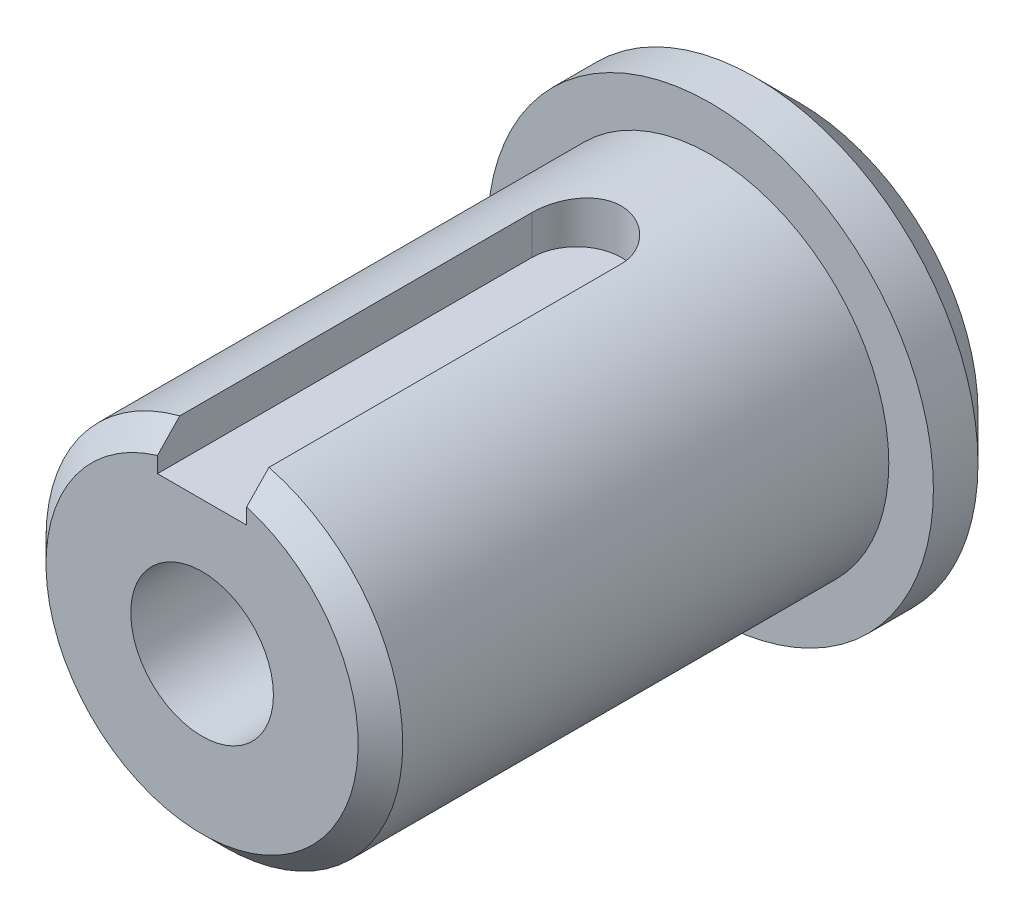
ISO-10303-21;
HEADER;
FILE_DESCRIPTION(('STEP AP214'),'2;1');
FILE_NAME('part.step','',(''),(''),'','','');
FILE_SCHEMA(('AUTOMOTIVE_DESIGN { 1 0 10303 214 1 1 1 1 }'));
ENDSEC;
DATA;
#1=APPLICATION_CONTEXT('core data for automotive mechanical design processes');
#2=APPLICATION_PROTOCOL_DEFINITION('international standard','automotive_design',2000,#1);
#3=PRODUCT_CONTEXT('',#1,'mechanical');
#4=PRODUCT('Part','Part','',(#3));
#5=PRODUCT_RELATED_PRODUCT_CATEGORY('part','',(#4));
#6=PRODUCT_DEFINITION_FORMATION('','',#4);
#7=PRODUCT_DEFINITION_CONTEXT('part definition',#1,'design');
#8=PRODUCT_DEFINITION('design','',#6,#7);
#9=PRODUCT_DEFINITION_SHAPE('','',#8);
#10=(LENGTH_UNIT() NAMED_UNIT(*) SI_UNIT(.MILLI.,.METRE.));
#11=(NAMED_UNIT(*) PLANE_ANGLE_UNIT() SI_UNIT($,.RADIAN.));
#12=(NAMED_UNIT(*) SI_UNIT($,.STERADIAN.) SOLID_ANGLE_UNIT());
#13=UNCERTAINTY_MEASURE_WITH_UNIT(LENGTH_MEASURE(1.E-05),#10,'distance_accuracy_value','');
#14=(GEOMETRIC_REPRESENTATION_CONTEXT(3) GLOBAL_UNCERTAINTY_ASSIGNED_CONTEXT((#13)) GLOBAL_UNIT_ASSIGNED_CONTEXT((#10,
#11,#12)) REPRESENTATION_CONTEXT('',''));
#15=CARTESIAN_POINT('',(0.,0.,0.));
#16=DIRECTION('',(0.,0.,1.));
#17=DIRECTION('',(1.,0.,0.));
#18=AXIS2_PLACEMENT_3D('',#15,#16,#17);
#19=CARTESIAN_POINT('',(0.,0.,0.));
#20=DIRECTION('',(0.,0.,1.));
#21=DIRECTION('',(1.,0.,0.));
#22=AXIS2_PLACEMENT_3D('',#19,#20,#21);
#23=CYLINDRICAL_SURFACE('',#22,1.6);
#24=CARTESIAN_POINT('',(0.,0.,0.));
#25=DIRECTION('',(0.,0.,1.));
#26=DIRECTION('',(1.,0.,0.));
#27=AXIS2_PLACEMENT_3D('',#24,#25,#26);
#28=CIRCLE('',#27,1.6);
#29=CARTESIAN_POINT('',(1.6,0.,0.));
#30=VERTEX_POINT('',#29);
#31=EDGE_CURVE('E99',#30,#30,#28,.T.);
#32=ORIENTED_EDGE('',*,*,#31,.F.);
#33=EDGE_LOOP('',(#32));
#34=FACE_BOUND('',#33,.T.);
#35=CARTESIAN_POINT('',(0.,0.,13.4));
#36=DIRECTION('',(0.,0.,1.));
#37=DIRECTION('',(1.,0.,0.));
#38=AXIS2_PLACEMENT_3D('',#35,#36,#37);
#39=CIRCLE('',#38,1.6);
#40=CARTESIAN_POINT('',(1.6,0.,13.4));
#41=VERTEX_POINT('',#40);
#42=EDGE_CURVE('E165',#41,#41,#39,.T.);
#43=ORIENTED_EDGE('',*,*,#42,.T.);
#44=EDGE_LOOP('',(#43));
#45=FACE_BOUND('',#44,.T.);
#46=ADVANCED_FACE('F41',(#34,#45),#23,.F.);
#47=CARTESIAN_POINT('',(0.,1.6,0.));
#48=DIRECTION('',(0.,0.,1.));
#49=DIRECTION('',(1.,0.,0.));
#50=AXIS2_PLACEMENT_3D('',#47,#48,#49);
#51=PLANE('',#50);
#52=CARTESIAN_POINT('',(0.,0.,0.));
#53=DIRECTION('',(0.,0.,1.));
#54=DIRECTION('',(1.,0.,0.));
#55=AXIS2_PLACEMENT_3D('',#52,#53,#54);
#56=CIRCLE('',#55,4.);
#57=CARTESIAN_POINT('',(4.,0.,0.));
#58=VERTEX_POINT('',#57);
#59=EDGE_CURVE('E176',#58,#58,#56,.T.);
#60=ORIENTED_EDGE('',*,*,#59,.F.);
#61=EDGE_LOOP('',(#60));
#62=FACE_BOUND('',#61,.T.);
#63=ORIENTED_EDGE('',*,*,#31,.T.);
#64=EDGE_LOOP('',(#63));
#65=FACE_BOUND('',#64,.T.);
#66=ADVANCED_FACE('F151',(#62,#65),#51,.F.);
#67=CARTESIAN_POINT('',(0.,0.,0.));
#68=DIRECTION('',(0.,0.,1.));
#69=DIRECTION('',(1.,0.,0.));
#70=AXIS2_PLACEMENT_3D('',#67,#68,#69);
#71=CONICAL_SURFACE('',#70,4.,0.785398163397447);
#72=CARTESIAN_POINT('',(0.,0.,1.));
#73=DIRECTION('',(0.,0.,1.));
#74=DIRECTION('',(1.,0.,0.));
#75=AXIS2_PLACEMENT_3D('',#72,#73,#74);
#76=CIRCLE('',#75,5.);
#77=CARTESIAN_POINT('',(5.,0.,1.));
#78=VERTEX_POINT('',#77);
#79=EDGE_CURVE('E180',#78,#78,#76,.T.);
#80=ORIENTED_EDGE('',*,*,#79,.F.);
#81=EDGE_LOOP('',(#80));
#82=FACE_BOUND('',#81,.T.);
#83=ORIENTED_EDGE('',*,*,#59,.T.);
#84=EDGE_LOOP('',(#83));
#85=FACE_BOUND('',#84,.T.);
#86=ADVANCED_FACE('F156',(#82,#85),#71,.T.);
#87=CARTESIAN_POINT('',(0.,0.,0.));
#88=DIRECTION('',(0.,0.,1.));
#89=DIRECTION('',(1.,0.,0.));
#90=AXIS2_PLACEMENT_3D('',#87,#88,#89);
#91=CYLINDRICAL_SURFACE('',#90,5.);
#92=CARTESIAN_POINT('',(0.,0.,2.));
#93=DIRECTION('',(0.,0.,1.));
#94=DIRECTION('',(1.,0.,0.));
#95=AXIS2_PLACEMENT_3D('',#92,#93,#94);
#96=CIRCLE('',#95,5.);
#97=CARTESIAN_POINT('',(5.,0.,2.));
#98=VERTEX_POINT('',#97);
#99=EDGE_CURVE('E172',#98,#98,#96,.T.);
#100=ORIENTED_EDGE('',*,*,#99,.F.);
#101=EDGE_LOOP('',(#100));
#102=FACE_BOUND('',#101,.T.);
#103=ORIENTED_EDGE('',*,*,#79,.T.);
#104=EDGE_LOOP('',(#103));
#105=FACE_BOUND('',#104,.T.);
#106=ADVANCED_FACE('F190',(#102,#105),#91,.T.);
#107=CARTESIAN_POINT('',(0.,5.,2.));
#108=DIRECTION('',(0.,0.,-1.));
#109=DIRECTION('',(-1.,0.,0.));
#110=AXIS2_PLACEMENT_3D('',#107,#108,#109);
#111=PLANE('',#110);
#112=CARTESIAN_POINT('',(0.,0.,2.));
#113=DIRECTION('',(0.,0.,1.));
#114=DIRECTION('',(1.,0.,0.));
#115=AXIS2_PLACEMENT_3D('',#112,#113,#114);
#116=CIRCLE('',#115,4.);
#117=CARTESIAN_POINT('',(4.,0.,2.));
#118=VERTEX_POINT('',#117);
#119=EDGE_CURVE('E173',#118,#118,#116,.T.);
#120=ORIENTED_EDGE('',*,*,#119,.F.);
#121=EDGE_LOOP('',(#120));
#122=FACE_BOUND('',#121,.T.);
#123=ORIENTED_EDGE('',*,*,#99,.T.);
#124=EDGE_LOOP('',(#123));
#125=FACE_BOUND('',#124,.T.);
#126=ADVANCED_FACE('F193',(#122,#125),#111,.F.);
#127=CARTESIAN_POINT('',(0.,0.,0.));
#128=DIRECTION('',(0.,0.,1.));
#129=DIRECTION('',(1.,0.,0.));
#130=AXIS2_PLACEMENT_3D('',#127,#128,#129);
#131=CYLINDRICAL_SURFACE('',#130,4.);
#132=CARTESIAN_POINT('',(0.,0.,12.9));
#133=DIRECTION('',(0.,0.,1.));
#134=DIRECTION('',(1.,0.,0.));
#135=AXIS2_PLACEMENT_3D('',#132,#133,#134);
#136=CIRCLE('',#135,4.);
#137=CARTESIAN_POINT('',(-1.,3.87298334620742,12.9));
#138=VERTEX_POINT('',#137);
#139=CARTESIAN_POINT('',(1.,3.87298334620742,12.9));
#140=VERTEX_POINT('',#139);
#141=EDGE_CURVE('E163',#138,#140,#136,.T.);
#142=ORIENTED_EDGE('',*,*,#141,.F.);
#143=DIRECTION('',(0.,0.,1.));
#144=VECTOR('',#143,1.);
#145=CARTESIAN_POINT('',(-1.,3.87298334620742,0.));
#146=LINE('',#145,#144);
#147=CARTESIAN_POINT('',(-1.,3.87298334620742,5.));
#148=VERTEX_POINT('',#147);
#149=EDGE_CURVE('E69',#138,#148,#146,.F.);
#150=ORIENTED_EDGE('',*,*,#149,.T.);
#151=CARTESIAN_POINT('',(-1.,3.87298334620742,5.));
#152=CARTESIAN_POINT('',(-1.00000033749611,3.87298148580177,4.97233701489346));
#153=CARTESIAN_POINT('',(-0.998851407375366,3.87328009949471,4.94468773698177));
#154=CARTESIAN_POINT('',(-0.994271295395754,3.87445904774559,4.88959596469644));
#155=CARTESIAN_POINT('',(-0.990840497572679,3.87533928441687,4.86215343631291));
#156=CARTESIAN_POINT('',(-0.977175239382526,3.87881710972054,4.78054682679116));
#157=CARTESIAN_POINT('',(-0.963567695172493,3.88225203148809,4.72694353151779));
#158=CARTESIAN_POINT('',(-0.927798076247997,3.89095422588003,4.62287532621803));
#159=CARTESIAN_POINT('',(-0.905636805423835,3.8962213263093,4.57241012178714));
#160=CARTESIAN_POINT('',(-0.853415378025865,3.90799134471939,4.47588855135267));
#161=CARTESIAN_POINT('',(-0.823353103356932,3.91449459395647,4.42983337210903));
#162=CARTESIAN_POINT('',(-0.755484471828069,3.92816262398025,4.3424561180939));
#163=CARTESIAN_POINT('',(-0.717537268783976,3.93533791028916,4.30124511375448));
#164=CARTESIAN_POINT('',(-0.63527578051623,3.94945104396193,4.22569791051729));
#165=CARTESIAN_POINT('',(-0.590960479478831,3.95638885322537,4.19136281053206));
#166=CARTESIAN_POINT('',(-0.49645689940169,3.96936182283248,4.13008899838136));
#167=CARTESIAN_POINT('',(-0.446195340334474,3.9753830468173,4.10326010401603));
#168=CARTESIAN_POINT('',(-0.341702590842919,3.98572346250589,4.05847526580329));
#169=CARTESIAN_POINT('',(-0.28747218408301,3.99004298914701,4.04051757570017));
#170=CARTESIAN_POINT('',(-0.177744108525161,3.99641900005128,4.01434100722257));
#171=CARTESIAN_POINT('',(-0.122294322002858,3.99851952901301,4.00593232757718));
#172=CARTESIAN_POINT('',(-0.0107327756816797,4.00037438150815,3.99849662845671));
#173=CARTESIAN_POINT('',(0.0453789000287056,4.00012899993445,3.99946842980766));
#174=CARTESIAN_POINT('',(0.155352492972096,3.99735237365736,4.01062996368545));
#175=CARTESIAN_POINT('',(0.209236701739855,3.99487198677361,4.02061461659948));
#176=CARTESIAN_POINT('',(0.31453871108434,3.98796330636496,4.04918867918275));
#177=CARTESIAN_POINT('',(0.365956402423988,3.98353492665556,4.06777846956858));
#178=CARTESIAN_POINT('',(0.465407286024539,3.97314997761798,4.11320128067065));
#179=CARTESIAN_POINT('',(0.513405629602248,3.96717993827555,4.14010739423284));
#180=CARTESIAN_POINT('',(0.604276631230014,3.95435945541919,4.20134312983347));
#181=CARTESIAN_POINT('',(0.647148515562289,3.94750887933198,4.23567387025322));
#182=CARTESIAN_POINT('',(0.72776938970849,3.93345566022865,4.31187891208131));
#183=CARTESIAN_POINT('',(0.765349103054127,3.92624850477685,4.35393163653981));
#184=CARTESIAN_POINT('',(0.832969575186237,3.91246168284006,4.44382986692773));
#185=CARTESIAN_POINT('',(0.863008270245061,3.90588218842993,4.49167695328356));
#186=CARTESIAN_POINT('',(0.914804709285961,3.89407813586325,4.59214559782377));
#187=CARTESIAN_POINT('',(0.936517017887269,3.88886106009137,4.64479146489608));
#188=CARTESIAN_POINT('',(0.970702351849828,3.88047058807055,4.75311692841828));
#189=CARTESIAN_POINT('',(0.983189189212131,3.87729413761435,4.80879185514984));
#190=CARTESIAN_POINT('',(0.993904635150937,3.87455290681524,4.8874573807589));
#191=CARTESIAN_POINT('',(0.996190790966708,3.8739652311086,4.90991970321318));
#192=CARTESIAN_POINT('',(0.999236757697393,3.87318062488974,4.95491778990932));
#193=CARTESIAN_POINT('',(0.999999038096045,3.87298306219461,4.97745337595529));
#194=CARTESIAN_POINT('',(1.,3.87298334620742,5.));
#195=B_SPLINE_CURVE_WITH_KNOTS('',3,(#151,#152,#153,#154,#155,#156,#157,#158,#159,#160,#161,
#162,#163,#164,#165,#166,#167,#168,#169,#170,#171,#172,#173,#174,#175,#176,#177,#178,#179,#180,
#181,#182,#183,#184,#185,#186,#187,#188,#189,#190,#191,#192,#193,#194),.UNSPECIFIED.,.F.,.F.,(4,
2,2,2,2,2,2,2,2,2,2,2,2,2,2,2,2,2,2,2,2,4),(0.,0.0829365303397693,0.165859106084651,
0.331229963080317,0.496585282091499,0.66198497472675,0.830641897427974,0.999325753539193,
1.17036187098235,1.34136430732424,1.50890481515325,1.67642426256639,1.84022545479275,
2.00403389475838,2.16932509450376,2.33464120964329,2.50441429534542,2.67423379180967,
2.84496720161067,3.01544447539986,3.08315848722648,3.15076267731671),.UNSPECIFIED.);
#196=CARTESIAN_POINT('',(1.,3.87298334620742,5.));
#197=VERTEX_POINT('',#196);
#198=EDGE_CURVE('E11',#148,#197,#195,.T.);
#199=ORIENTED_EDGE('',*,*,#198,.T.);
#200=DIRECTION('',(0.,0.,1.));
#201=VECTOR('',#200,1.);
#202=CARTESIAN_POINT('',(1.,3.87298334620742,0.));
#203=LINE('',#202,#201);
#204=EDGE_CURVE('E126',#197,#140,#203,.T.);
#205=ORIENTED_EDGE('',*,*,#204,.T.);
#206=EDGE_LOOP('',(#142,#150,#199,#205));
#207=FACE_BOUND('',#206,.T.);
#208=ORIENTED_EDGE('',*,*,#119,.T.);
#209=EDGE_LOOP('',(#208));
#210=FACE_BOUND('',#209,.T.);
#211=ADVANCED_FACE('F150',(#207,#210),#131,.T.);
#212=CARTESIAN_POINT('',(0.,0.,12.9));
#213=DIRECTION('',(0.,0.,-1.));
#214=DIRECTION('',(-1.,0.,0.));
#215=AXIS2_PLACEMENT_3D('',#212,#213,#214);
#216=CONICAL_SURFACE('',#215,4.,0.785398163397447);
#217=CARTESIAN_POINT('',(0.,0.,13.4));
#218=DIRECTION('',(0.,0.,1.));
#219=DIRECTION('',(1.,0.,0.));
#220=AXIS2_PLACEMENT_3D('',#217,#218,#219);
#221=CIRCLE('',#220,3.5);
#222=CARTESIAN_POINT('',(-1.,3.35410196624968,13.4));
#223=VERTEX_POINT('',#222);
#224=CARTESIAN_POINT('',(1.,3.35410196624968,13.4));
#225=VERTEX_POINT('',#224);
#226=EDGE_CURVE('E114',#223,#225,#221,.T.);
#227=ORIENTED_EDGE('',*,*,#226,.F.);
#228=CARTESIAN_POINT('',(-1.,2.16166818275801,14.5182339887495));
#229=CARTESIAN_POINT('',(-1.,2.24778539076045,14.4400495264871));
#230=CARTESIAN_POINT('',(-1.,2.33351705427441,14.3614435994032));
#231=CARTESIAN_POINT('',(-1.,2.50436444075498,14.2035685916532));
#232=CARTESIAN_POINT('',(-1.,2.58948017752038,14.1242995259298));
#233=CARTESIAN_POINT('',(-1.,2.75925021712955,13.9652787003744));
#234=CARTESIAN_POINT('',(-1.,2.84390454418649,13.8855269663437));
#235=CARTESIAN_POINT('',(-1.,3.01285385337302,13.725642859283));
#236=CARTESIAN_POINT('',(-1.,3.09714883316616,13.6455104837853));
#237=CARTESIAN_POINT('',(-1.,3.34959667571459,13.4046839939829));
#238=CARTESIAN_POINT('',(-1.,3.51732685048182,13.243546962752));
#239=CARTESIAN_POINT('',(-1.,3.85204910097382,12.9205050338407));
#240=CARTESIAN_POINT('',(-1.,4.01904116674868,12.7586001258696));
#241=CARTESIAN_POINT('',(-1.,4.32504897303705,12.460968635175));
#242=CARTESIAN_POINT('',(-1.,4.46414270728864,12.3253221940053));
#243=CARTESIAN_POINT('',(-1.,4.74205519603328,12.0537394343798));
#244=CARTESIAN_POINT('',(-1.,4.88087394205808,11.9178031072566));
#245=CARTESIAN_POINT('',(-1.,5.01959352573439,11.7817660112501));
#246=B_SPLINE_CURVE_WITH_KNOTS('',3,(#228,#229,#230,#231,#232,#233,#234,#235,#236,#237,#238,
#239,#240,#241,#242,#243,#244,#245),.UNSPECIFIED.,.F.,.F.,(4,2,2,2,2,2,2,2,4),(0.,
0.348937994921588,0.697868148129732,1.04677981092494,1.39569373886185,2.09346225124986,
2.79124014123565,3.37409749189515,3.95697252096203),.UNSPECIFIED.);
#247=EDGE_CURVE('E167',#223,#138,#246,.T.);
#248=ORIENTED_EDGE('',*,*,#247,.T.);
#249=ORIENTED_EDGE('',*,*,#141,.T.);
#250=CARTESIAN_POINT('',(1.,5.01959352573439,11.7817660112501));
#251=CARTESIAN_POINT('',(1.,4.90188159818296,11.8972081766581));
#252=CARTESIAN_POINT('',(1.,4.78409405290292,12.0125730901077));
#253=CARTESIAN_POINT('',(1.,4.54832563402261,12.243106231456));
#254=CARTESIAN_POINT('',(1.,4.43034475955825,12.3582744584708));
#255=CARTESIAN_POINT('',(1.,4.07606767787835,12.7034026348856));
#256=CARTESIAN_POINT('',(1.,3.83941998825705,12.9330027996637));
#257=CARTESIAN_POINT('',(1.,3.4832529291617,13.2761812065402));
#258=CARTESIAN_POINT('',(1.,3.36432670743436,13.3903747539779));
#259=CARTESIAN_POINT('',(1.,3.12593585665128,13.6181962248205));
#260=CARTESIAN_POINT('',(1.,3.00647123362626,13.7318241545313));
#261=CARTESIAN_POINT('',(1.,2.76678976139718,13.958303300516));
#262=CARTESIAN_POINT('',(1.,2.6465728577209,14.0711544592724));
#263=CARTESIAN_POINT('',(1.,2.46543974132751,14.2395674372342));
#264=CARTESIAN_POINT('',(1.,2.40492627055208,14.2955621749514));
#265=CARTESIAN_POINT('',(1.,2.28356453649156,14.4071889545584));
#266=CARTESIAN_POINT('',(1.,2.22271626925536,14.4628209921507));
#267=CARTESIAN_POINT('',(1.,2.16166818275754,14.5182339887499));
#268=B_SPLINE_CURVE_WITH_KNOTS('',3,(#250,#251,#252,#253,#254,#255,#256,#257,#258,#259,#260,
#261,#262,#263,#264,#265,#266,#267),.UNSPECIFIED.,.F.,.F.,(4,2,2,2,2,2,2,2,4),(0.,
0.494617662763852,0.989237542258999,1.97840571649359,2.47302799783527,2.96764475253075,
3.46229774641327,3.70963348854709,3.95697215590979),.UNSPECIFIED.);
#269=EDGE_CURVE('E119',#140,#225,#268,.T.);
#270=ORIENTED_EDGE('',*,*,#269,.T.);
#271=EDGE_LOOP('',(#227,#248,#249,#270));
#272=FACE_BOUND('',#271,.T.);
#273=ADVANCED_FACE('F133',(#272),#216,.T.);
#274=CARTESIAN_POINT('',(0.,3.5,13.4));
#275=DIRECTION('',(0.,0.,-1.));
#276=DIRECTION('',(-1.,0.,0.));
#277=AXIS2_PLACEMENT_3D('',#274,#275,#276);
#278=PLANE('',#277);
#279=ORIENTED_EDGE('',*,*,#42,.F.);
#280=EDGE_LOOP('',(#279));
#281=FACE_BOUND('',#280,.T.);
#282=DIRECTION('',(1.,0.,0.));
#283=VECTOR('',#282,1.);
#284=CARTESIAN_POINT('',(0.,3.,13.4));
#285=LINE('',#284,#283);
#286=CARTESIAN_POINT('',(-1.,3.,13.4));
#287=VERTEX_POINT('',#286);
#288=CARTESIAN_POINT('',(1.,3.,13.4));
#289=VERTEX_POINT('',#288);
#290=EDGE_CURVE('E53',#287,#289,#285,.T.);
#291=ORIENTED_EDGE('',*,*,#290,.F.);
#292=DIRECTION('',(0.,1.,0.));
#293=VECTOR('',#292,1.);
#294=CARTESIAN_POINT('',(-1.,3.,13.4));
#295=LINE('',#294,#293);
#296=EDGE_CURVE('E129',#287,#223,#295,.T.);
#297=ORIENTED_EDGE('',*,*,#296,.T.);
#298=ORIENTED_EDGE('',*,*,#226,.T.);
#299=DIRECTION('',(0.,1.,0.));
#300=VECTOR('',#299,1.);
#301=CARTESIAN_POINT('',(1.,3.,13.4));
#302=LINE('',#301,#300);
#303=EDGE_CURVE('E103',#289,#225,#302,.T.);
#304=ORIENTED_EDGE('',*,*,#303,.F.);
#305=EDGE_LOOP('',(#291,#297,#298,#304));
#306=FACE_BOUND('',#305,.T.);
#307=ADVANCED_FACE('F112',(#281,#306),#278,.F.);
#308=CARTESIAN_POINT('',(0.,3.,5.));
#309=DIRECTION('',(0.,1.,0.));
#310=DIRECTION('',(0.,0.,1.));
#311=AXIS2_PLACEMENT_3D('',#308,#309,#310);
#312=CYLINDRICAL_SURFACE('',#311,1.);
#313=DIRECTION('',(0.,1.,0.));
#314=VECTOR('',#313,1.);
#315=CARTESIAN_POINT('',(-1.,3.,5.));
#316=LINE('',#315,#314);
#317=CARTESIAN_POINT('',(-1.,3.,5.));
#318=VERTEX_POINT('',#317);
#319=EDGE_CURVE('E113',#318,#148,#316,.T.);
#320=ORIENTED_EDGE('',*,*,#319,.F.);
#321=CARTESIAN_POINT('',(0.,3.,5.));
#322=DIRECTION('',(0.,1.,0.));
#323=DIRECTION('',(0.,0.,1.));
#324=AXIS2_PLACEMENT_3D('',#321,#322,#323);
#325=CIRCLE('',#324,1.);
#326=CARTESIAN_POINT('',(1.,3.,5.));
#327=VERTEX_POINT('',#326);
#328=EDGE_CURVE('E107',#327,#318,#325,.T.);
#329=ORIENTED_EDGE('',*,*,#328,.F.);
#330=DIRECTION('',(0.,1.,0.));
#331=VECTOR('',#330,1.);
#332=CARTESIAN_POINT('',(1.,3.,5.));
#333=LINE('',#332,#331);
#334=EDGE_CURVE('E106',#327,#197,#333,.T.);
#335=ORIENTED_EDGE('',*,*,#334,.T.);
#336=ORIENTED_EDGE('',*,*,#198,.F.);
#337=EDGE_LOOP('',(#320,#329,#335,#336));
#338=FACE_BOUND('',#337,.T.);
#339=ADVANCED_FACE('F140',(#338),#312,.F.);
#340=CARTESIAN_POINT('',(-1.,3.,13.4));
#341=DIRECTION('',(-1.,0.,0.));
#342=DIRECTION('',(0.,0.,1.));
#343=AXIS2_PLACEMENT_3D('',#340,#341,#342);
#344=PLANE('',#343);
#345=ORIENTED_EDGE('',*,*,#247,.F.);
#346=ORIENTED_EDGE('',*,*,#296,.F.);
#347=DIRECTION('',(0.,0.,1.));
#348=VECTOR('',#347,1.);
#349=CARTESIAN_POINT('',(-1.,3.,13.4));
#350=LINE('',#349,#348);
#351=EDGE_CURVE('E63',#318,#287,#350,.T.);
#352=ORIENTED_EDGE('',*,*,#351,.F.);
#353=ORIENTED_EDGE('',*,*,#319,.T.);
#354=ORIENTED_EDGE('',*,*,#149,.F.);
#355=EDGE_LOOP('',(#345,#346,#352,#353,#354));
#356=FACE_BOUND('',#355,.T.);
#357=ADVANCED_FACE('F137',(#356),#344,.F.);
#358=CARTESIAN_POINT('',(1.,3.,13.4));
#359=DIRECTION('',(1.,0.,0.));
#360=DIRECTION('',(0.,0.,-1.));
#361=AXIS2_PLACEMENT_3D('',#358,#359,#360);
#362=PLANE('',#361);
#363=ORIENTED_EDGE('',*,*,#334,.F.);
#364=DIRECTION('',(0.,0.,-1.));
#365=VECTOR('',#364,1.);
#366=CARTESIAN_POINT('',(1.,3.,13.4));
#367=LINE('',#366,#365);
#368=EDGE_CURVE('E96',#289,#327,#367,.T.);
#369=ORIENTED_EDGE('',*,*,#368,.F.);
#370=ORIENTED_EDGE('',*,*,#303,.T.);
#371=ORIENTED_EDGE('',*,*,#269,.F.);
#372=ORIENTED_EDGE('',*,*,#204,.F.);
#373=EDGE_LOOP('',(#363,#369,#370,#371,#372));
#374=FACE_BOUND('',#373,.T.);
#375=ADVANCED_FACE('F105',(#374),#362,.F.);
#376=CARTESIAN_POINT('',(0.,3.,13.4));
#377=DIRECTION('',(0.,1.,0.));
#378=DIRECTION('',(0.,0.,1.));
#379=AXIS2_PLACEMENT_3D('',#376,#377,#378);
#380=PLANE('',#379);
#381=ORIENTED_EDGE('',*,*,#290,.T.);
#382=ORIENTED_EDGE('',*,*,#368,.T.);
#383=ORIENTED_EDGE('',*,*,#328,.T.);
#384=ORIENTED_EDGE('',*,*,#351,.T.);
#385=EDGE_LOOP('',(#381,#382,#383,#384));
#386=FACE_BOUND('',#385,.T.);
#387=ADVANCED_FACE('F92',(#386),#380,.T.);
#388=CLOSED_SHELL('',(#46,#66,#86,#106,#126,#211,#273,#307,#339,#357,#375,#387));
#389=MANIFOLD_SOLID_BREP('B2',#388);
#390=ADVANCED_BREP_SHAPE_REPRESENTATION('',(#18,#389),#14);
#391=SHAPE_DEFINITION_REPRESENTATION(#9,#390);
ENDSEC;
END-ISO-10303-21;
